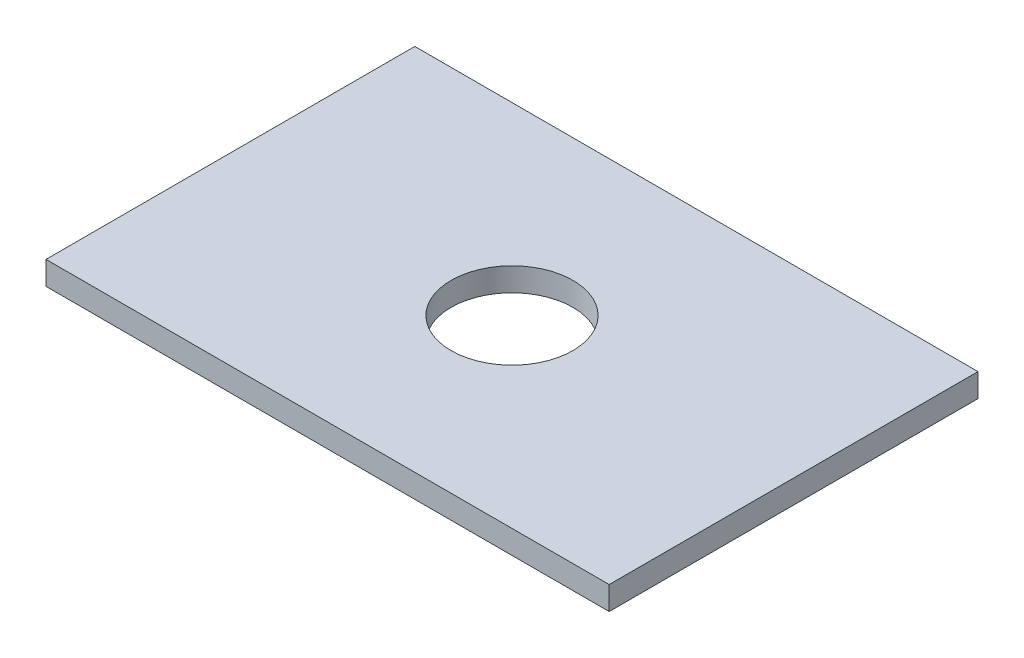
ISO-10303-21;
HEADER;
FILE_DESCRIPTION(('STEP AP214'),'2;1');
FILE_NAME('part.step','',(''),(''),'','','');
FILE_SCHEMA(('AUTOMOTIVE_DESIGN { 1 0 10303 214 1 1 1 1 }'));
ENDSEC;
DATA;
#1=APPLICATION_CONTEXT('core data for automotive mechanical design processes');
#2=APPLICATION_PROTOCOL_DEFINITION('international standard','automotive_design',2000,#1);
#3=PRODUCT_CONTEXT('',#1,'mechanical');
#4=PRODUCT('Part','Part','',(#3));
#5=PRODUCT_RELATED_PRODUCT_CATEGORY('part','',(#4));
#6=PRODUCT_DEFINITION_FORMATION('','',#4);
#7=PRODUCT_DEFINITION_CONTEXT('part definition',#1,'design');
#8=PRODUCT_DEFINITION('design','',#6,#7);
#9=PRODUCT_DEFINITION_SHAPE('','',#8);
#10=(LENGTH_UNIT() NAMED_UNIT(*) SI_UNIT(.MILLI.,.METRE.));
#11=(NAMED_UNIT(*) PLANE_ANGLE_UNIT() SI_UNIT($,.RADIAN.));
#12=(NAMED_UNIT(*) SI_UNIT($,.STERADIAN.) SOLID_ANGLE_UNIT());
#13=UNCERTAINTY_MEASURE_WITH_UNIT(LENGTH_MEASURE(1.E-05),#10,'distance_accuracy_value','');
#14=(GEOMETRIC_REPRESENTATION_CONTEXT(3) GLOBAL_UNCERTAINTY_ASSIGNED_CONTEXT((#13)) GLOBAL_UNIT_ASSIGNED_CONTEXT((#10,
#11,#12)) REPRESENTATION_CONTEXT('',''));
#15=CARTESIAN_POINT('',(0.,0.,0.));
#16=DIRECTION('',(0.,0.,1.));
#17=DIRECTION('',(1.,0.,0.));
#18=AXIS2_PLACEMENT_3D('',#15,#16,#17);
#19=CARTESIAN_POINT('',(0.,6.35,0.));
#20=DIRECTION('',(1.,0.,0.));
#21=DIRECTION('',(0.,0.,-1.));
#22=AXIS2_PLACEMENT_3D('',#19,#20,#21);
#23=PLANE('',#22);
#24=DIRECTION('',(0.,0.,1.));
#25=VECTOR('',#24,1.);
#26=CARTESIAN_POINT('',(0.,0.,0.));
#27=LINE('',#26,#25);
#28=CARTESIAN_POINT('',(0.,0.,-100.));
#29=VERTEX_POINT('',#28);
#30=CARTESIAN_POINT('',(0.,0.,0.));
#31=VERTEX_POINT('',#30);
#32=EDGE_CURVE('E98',#29,#31,#27,.T.);
#33=ORIENTED_EDGE('',*,*,#32,.T.);
#34=DIRECTION('',(0.,-1.,0.));
#35=VECTOR('',#34,1.);
#36=CARTESIAN_POINT('',(0.,6.35,0.));
#37=LINE('',#36,#35);
#38=CARTESIAN_POINT('',(0.,6.35,0.));
#39=VERTEX_POINT('',#38);
#40=EDGE_CURVE('E11',#39,#31,#37,.T.);
#41=ORIENTED_EDGE('',*,*,#40,.F.);
#42=DIRECTION('',(0.,0.,1.));
#43=VECTOR('',#42,1.);
#44=CARTESIAN_POINT('',(0.,6.35,0.));
#45=LINE('',#44,#43);
#46=CARTESIAN_POINT('',(0.,6.35,-100.));
#47=VERTEX_POINT('',#46);
#48=EDGE_CURVE('E85',#47,#39,#45,.T.);
#49=ORIENTED_EDGE('',*,*,#48,.F.);
#50=DIRECTION('',(0.,-1.,0.));
#51=VECTOR('',#50,1.);
#52=CARTESIAN_POINT('',(0.,6.35,-100.));
#53=LINE('',#52,#51);
#54=EDGE_CURVE('E94',#47,#29,#53,.T.);
#55=ORIENTED_EDGE('',*,*,#54,.T.);
#56=EDGE_LOOP('',(#33,#41,#49,#55));
#57=FACE_BOUND('',#56,.T.);
#58=ADVANCED_FACE('F33',(#57),#23,.F.);
#59=CARTESIAN_POINT('',(0.,6.35,0.));
#60=DIRECTION('',(0.,0.,-1.));
#61=DIRECTION('',(-1.,0.,0.));
#62=AXIS2_PLACEMENT_3D('',#59,#60,#61);
#63=PLANE('',#62);
#64=DIRECTION('',(1.,0.,0.));
#65=VECTOR('',#64,1.);
#66=CARTESIAN_POINT('',(0.,0.,0.));
#67=LINE('',#66,#65);
#68=CARTESIAN_POINT('',(152.7,0.,0.));
#69=VERTEX_POINT('',#68);
#70=EDGE_CURVE('E89',#31,#69,#67,.T.);
#71=ORIENTED_EDGE('',*,*,#70,.T.);
#72=DIRECTION('',(0.,-1.,0.));
#73=VECTOR('',#72,1.);
#74=CARTESIAN_POINT('',(152.7,6.35,0.));
#75=LINE('',#74,#73);
#76=CARTESIAN_POINT('',(152.7,6.35,0.));
#77=VERTEX_POINT('',#76);
#78=EDGE_CURVE('E42',#77,#69,#75,.T.);
#79=ORIENTED_EDGE('',*,*,#78,.F.);
#80=DIRECTION('',(1.,0.,0.));
#81=VECTOR('',#80,1.);
#82=CARTESIAN_POINT('',(0.,6.35,0.));
#83=LINE('',#82,#81);
#84=EDGE_CURVE('E80',#39,#77,#83,.T.);
#85=ORIENTED_EDGE('',*,*,#84,.F.);
#86=ORIENTED_EDGE('',*,*,#40,.T.);
#87=EDGE_LOOP('',(#71,#79,#85,#86));
#88=FACE_BOUND('',#87,.T.);
#89=ADVANCED_FACE('F88',(#88),#63,.F.);
#90=CARTESIAN_POINT('',(152.7,6.35,0.));
#91=DIRECTION('',(-1.,0.,0.));
#92=DIRECTION('',(0.,0.,1.));
#93=AXIS2_PLACEMENT_3D('',#90,#91,#92);
#94=PLANE('',#93);
#95=DIRECTION('',(0.,0.,-1.));
#96=VECTOR('',#95,1.);
#97=CARTESIAN_POINT('',(152.7,0.,0.));
#98=LINE('',#97,#96);
#99=CARTESIAN_POINT('',(152.7,0.,-100.));
#100=VERTEX_POINT('',#99);
#101=EDGE_CURVE('E67',#69,#100,#98,.T.);
#102=ORIENTED_EDGE('',*,*,#101,.T.);
#103=DIRECTION('',(0.,-1.,0.));
#104=VECTOR('',#103,1.);
#105=CARTESIAN_POINT('',(152.7,6.35,-100.));
#106=LINE('',#105,#104);
#107=CARTESIAN_POINT('',(152.7,6.35,-100.));
#108=VERTEX_POINT('',#107);
#109=EDGE_CURVE('E90',#108,#100,#106,.T.);
#110=ORIENTED_EDGE('',*,*,#109,.F.);
#111=DIRECTION('',(0.,0.,-1.));
#112=VECTOR('',#111,1.);
#113=CARTESIAN_POINT('',(152.7,6.35,0.));
#114=LINE('',#113,#112);
#115=EDGE_CURVE('E83',#77,#108,#114,.T.);
#116=ORIENTED_EDGE('',*,*,#115,.F.);
#117=ORIENTED_EDGE('',*,*,#78,.T.);
#118=EDGE_LOOP('',(#102,#110,#116,#117));
#119=FACE_BOUND('',#118,.T.);
#120=ADVANCED_FACE('F92',(#119),#94,.F.);
#121=CARTESIAN_POINT('',(0.,6.35,-100.));
#122=DIRECTION('',(0.,0.,1.));
#123=DIRECTION('',(1.,0.,0.));
#124=AXIS2_PLACEMENT_3D('',#121,#122,#123);
#125=PLANE('',#124);
#126=DIRECTION('',(-1.,0.,0.));
#127=VECTOR('',#126,1.);
#128=CARTESIAN_POINT('',(0.,0.,-100.));
#129=LINE('',#128,#127);
#130=EDGE_CURVE('E73',#100,#29,#129,.T.);
#131=ORIENTED_EDGE('',*,*,#130,.T.);
#132=ORIENTED_EDGE('',*,*,#54,.F.);
#133=DIRECTION('',(-1.,0.,0.));
#134=VECTOR('',#133,1.);
#135=CARTESIAN_POINT('',(0.,6.35,-100.));
#136=LINE('',#135,#134);
#137=EDGE_CURVE('E50',#108,#47,#136,.T.);
#138=ORIENTED_EDGE('',*,*,#137,.F.);
#139=ORIENTED_EDGE('',*,*,#109,.T.);
#140=EDGE_LOOP('',(#131,#132,#138,#139));
#141=FACE_BOUND('',#140,.T.);
#142=ADVANCED_FACE('F105',(#141),#125,.F.);
#143=CARTESIAN_POINT('',(0.,6.35,0.));
#144=DIRECTION('',(0.,-1.,0.));
#145=DIRECTION('',(0.,0.,-1.));
#146=AXIS2_PLACEMENT_3D('',#143,#144,#145);
#147=PLANE('',#146);
#148=CARTESIAN_POINT('',(76.35,6.35,-50.));
#149=DIRECTION('',(0.,1.,0.));
#150=DIRECTION('',(0.,0.,1.));
#151=AXIS2_PLACEMENT_3D('',#148,#149,#150);
#152=CIRCLE('',#151,16.51);
#153=CARTESIAN_POINT('',(76.35,6.35,-33.49));
#154=VERTEX_POINT('',#153);
#155=EDGE_CURVE('E111',#154,#154,#152,.T.);
#156=ORIENTED_EDGE('',*,*,#155,.F.);
#157=EDGE_LOOP('',(#156));
#158=FACE_BOUND('',#157,.T.);
#159=ORIENTED_EDGE('',*,*,#48,.T.);
#160=ORIENTED_EDGE('',*,*,#84,.T.);
#161=ORIENTED_EDGE('',*,*,#115,.T.);
#162=ORIENTED_EDGE('',*,*,#137,.T.);
#163=EDGE_LOOP('',(#159,#160,#161,#162));
#164=FACE_BOUND('',#163,.T.);
#165=ADVANCED_FACE('F81',(#158,#164),#147,.F.);
#166=CARTESIAN_POINT('',(0.,0.,0.));
#167=DIRECTION('',(0.,-1.,0.));
#168=DIRECTION('',(0.,0.,-1.));
#169=AXIS2_PLACEMENT_3D('',#166,#167,#168);
#170=PLANE('',#169);
#171=CARTESIAN_POINT('',(76.35,0.,-50.));
#172=DIRECTION('',(0.,-1.,0.));
#173=DIRECTION('',(0.,0.,-1.));
#174=AXIS2_PLACEMENT_3D('',#171,#172,#173);
#175=CIRCLE('',#174,16.51);
#176=CARTESIAN_POINT('',(76.35,0.,-66.51));
#177=VERTEX_POINT('',#176);
#178=EDGE_CURVE('E36',#177,#177,#175,.T.);
#179=ORIENTED_EDGE('',*,*,#178,.F.);
#180=EDGE_LOOP('',(#179));
#181=FACE_BOUND('',#180,.T.);
#182=ORIENTED_EDGE('',*,*,#32,.F.);
#183=ORIENTED_EDGE('',*,*,#130,.F.);
#184=ORIENTED_EDGE('',*,*,#101,.F.);
#185=ORIENTED_EDGE('',*,*,#70,.F.);
#186=EDGE_LOOP('',(#182,#183,#184,#185));
#187=FACE_BOUND('',#186,.T.);
#188=ADVANCED_FACE('F108',(#181,#187),#170,.T.);
#189=CARTESIAN_POINT('',(76.35,-3.65,-50.));
#190=DIRECTION('',(0.,1.,0.));
#191=DIRECTION('',(0.,0.,1.));
#192=AXIS2_PLACEMENT_3D('',#189,#190,#191);
#193=CYLINDRICAL_SURFACE('',#192,16.51);
#194=ORIENTED_EDGE('',*,*,#178,.T.);
#195=EDGE_LOOP('',(#194));
#196=FACE_BOUND('',#195,.T.);
#197=ORIENTED_EDGE('',*,*,#155,.T.);
#198=EDGE_LOOP('',(#197));
#199=FACE_BOUND('',#198,.T.);
#200=ADVANCED_FACE('F118',(#196,#199),#193,.F.);
#201=CLOSED_SHELL('',(#58,#89,#120,#142,#165,#188,#200));
#202=MANIFOLD_SOLID_BREP('B2',#201);
#203=ADVANCED_BREP_SHAPE_REPRESENTATION('',(#18,#202),#14);
#204=SHAPE_DEFINITION_REPRESENTATION(#9,#203);
ENDSEC;
END-ISO-10303-21;
